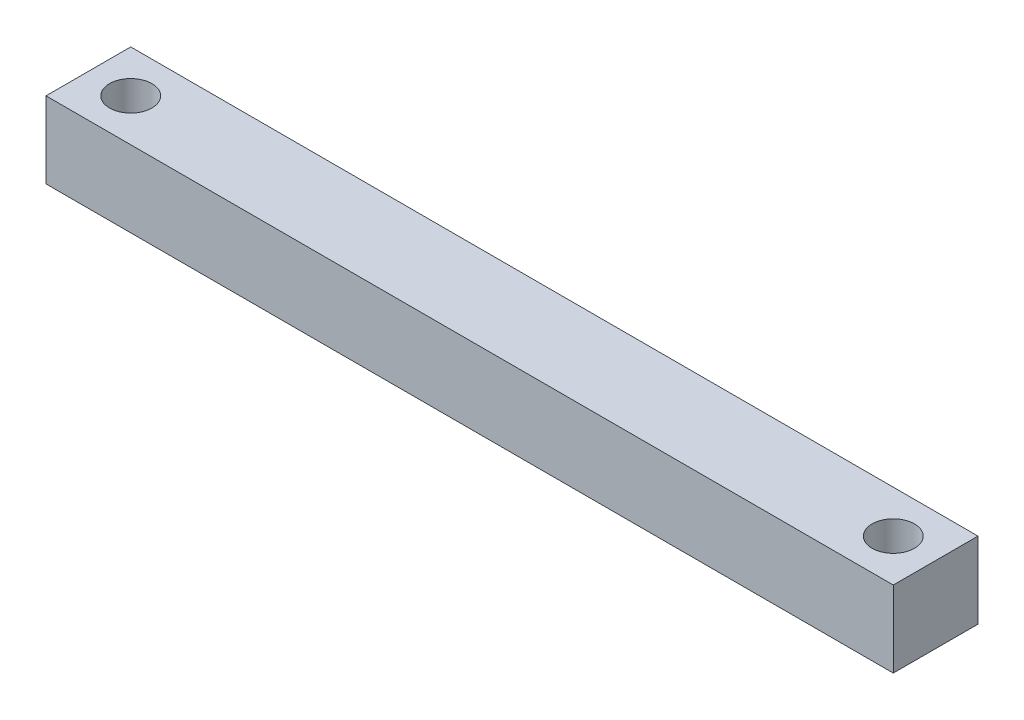
ISO-10303-21;
HEADER;
FILE_DESCRIPTION(('STEP AP214'),'2;1');
FILE_NAME('part.step','',(''),(''),'','','');
FILE_SCHEMA(('AUTOMOTIVE_DESIGN { 1 0 10303 214 1 1 1 1 }'));
ENDSEC;
DATA;
#1=APPLICATION_CONTEXT('core data for automotive mechanical design processes');
#2=APPLICATION_PROTOCOL_DEFINITION('international standard','automotive_design',2000,#1);
#3=PRODUCT_CONTEXT('',#1,'mechanical');
#4=PRODUCT('Part','Part','',(#3));
#5=PRODUCT_RELATED_PRODUCT_CATEGORY('part','',(#4));
#6=PRODUCT_DEFINITION_FORMATION('','',#4);
#7=PRODUCT_DEFINITION_CONTEXT('part definition',#1,'design');
#8=PRODUCT_DEFINITION('design','',#6,#7);
#9=PRODUCT_DEFINITION_SHAPE('','',#8);
#10=(LENGTH_UNIT() NAMED_UNIT(*) SI_UNIT(.MILLI.,.METRE.));
#11=(NAMED_UNIT(*) PLANE_ANGLE_UNIT() SI_UNIT($,.RADIAN.));
#12=(NAMED_UNIT(*) SI_UNIT($,.STERADIAN.) SOLID_ANGLE_UNIT());
#13=UNCERTAINTY_MEASURE_WITH_UNIT(LENGTH_MEASURE(1.E-05),#10,'distance_accuracy_value','');
#14=(GEOMETRIC_REPRESENTATION_CONTEXT(3) GLOBAL_UNCERTAINTY_ASSIGNED_CONTEXT((#13)) GLOBAL_UNIT_ASSIGNED_CONTEXT((#10,
#11,#12)) REPRESENTATION_CONTEXT('',''));
#15=CARTESIAN_POINT('',(0.,0.,0.));
#16=DIRECTION('',(0.,0.,1.));
#17=DIRECTION('',(1.,0.,0.));
#18=AXIS2_PLACEMENT_3D('',#15,#16,#17);
#19=CARTESIAN_POINT('',(-50.,9.00488900129855,-5.));
#20=DIRECTION('',(1.,0.,0.));
#21=DIRECTION('',(0.,0.,-1.));
#22=AXIS2_PLACEMENT_3D('',#19,#20,#21);
#23=PLANE('',#22);
#24=DIRECTION('',(0.,0.,1.));
#25=VECTOR('',#24,1.);
#26=CARTESIAN_POINT('',(-50.,0.,-5.));
#27=LINE('',#26,#25);
#28=CARTESIAN_POINT('',(-50.,0.,-5.));
#29=VERTEX_POINT('',#28);
#30=CARTESIAN_POINT('',(-50.,0.,5.));
#31=VERTEX_POINT('',#30);
#32=EDGE_CURVE('E99',#29,#31,#27,.T.);
#33=ORIENTED_EDGE('',*,*,#32,.T.);
#34=DIRECTION('',(0.,-1.,0.));
#35=VECTOR('',#34,1.);
#36=CARTESIAN_POINT('',(-50.,9.00488900129855,5.));
#37=LINE('',#36,#35);
#38=CARTESIAN_POINT('',(-50.,9.00488900129855,5.));
#39=VERTEX_POINT('',#38);
#40=EDGE_CURVE('E11',#39,#31,#37,.T.);
#41=ORIENTED_EDGE('',*,*,#40,.F.);
#42=DIRECTION('',(0.,0.,1.));
#43=VECTOR('',#42,1.);
#44=CARTESIAN_POINT('',(-50.,9.00488900129855,-5.));
#45=LINE('',#44,#43);
#46=CARTESIAN_POINT('',(-50.,9.00488900129855,-5.));
#47=VERTEX_POINT('',#46);
#48=EDGE_CURVE('E87',#47,#39,#45,.T.);
#49=ORIENTED_EDGE('',*,*,#48,.F.);
#50=DIRECTION('',(0.,-1.,0.));
#51=VECTOR('',#50,1.);
#52=CARTESIAN_POINT('',(-50.,9.00488900129855,-5.));
#53=LINE('',#52,#51);
#54=EDGE_CURVE('E95',#47,#29,#53,.T.);
#55=ORIENTED_EDGE('',*,*,#54,.T.);
#56=EDGE_LOOP('',(#33,#41,#49,#55));
#57=FACE_BOUND('',#56,.T.);
#58=ADVANCED_FACE('F36',(#57),#23,.F.);
#59=CARTESIAN_POINT('',(-50.,9.00488900129855,5.));
#60=DIRECTION('',(0.,0.,-1.));
#61=DIRECTION('',(-1.,0.,0.));
#62=AXIS2_PLACEMENT_3D('',#59,#60,#61);
#63=PLANE('',#62);
#64=DIRECTION('',(1.,0.,0.));
#65=VECTOR('',#64,1.);
#66=CARTESIAN_POINT('',(-50.,0.,5.));
#67=LINE('',#66,#65);
#68=CARTESIAN_POINT('',(50.,0.,5.));
#69=VERTEX_POINT('',#68);
#70=EDGE_CURVE('E91',#31,#69,#67,.T.);
#71=ORIENTED_EDGE('',*,*,#70,.T.);
#72=DIRECTION('',(0.,-1.,0.));
#73=VECTOR('',#72,1.);
#74=CARTESIAN_POINT('',(50.,9.00488900129855,5.));
#75=LINE('',#74,#73);
#76=CARTESIAN_POINT('',(50.,9.00488900129855,5.));
#77=VERTEX_POINT('',#76);
#78=EDGE_CURVE('E44',#77,#69,#75,.T.);
#79=ORIENTED_EDGE('',*,*,#78,.F.);
#80=DIRECTION('',(1.,0.,0.));
#81=VECTOR('',#80,1.);
#82=CARTESIAN_POINT('',(-50.,9.00488900129855,5.));
#83=LINE('',#82,#81);
#84=EDGE_CURVE('E82',#39,#77,#83,.T.);
#85=ORIENTED_EDGE('',*,*,#84,.F.);
#86=ORIENTED_EDGE('',*,*,#40,.T.);
#87=EDGE_LOOP('',(#71,#79,#85,#86));
#88=FACE_BOUND('',#87,.T.);
#89=ADVANCED_FACE('F90',(#88),#63,.F.);
#90=CARTESIAN_POINT('',(50.,9.00488900129855,-5.));
#91=DIRECTION('',(-1.,0.,0.));
#92=DIRECTION('',(0.,0.,1.));
#93=AXIS2_PLACEMENT_3D('',#90,#91,#92);
#94=PLANE('',#93);
#95=DIRECTION('',(0.,0.,-1.));
#96=VECTOR('',#95,1.);
#97=CARTESIAN_POINT('',(50.,0.,-5.));
#98=LINE('',#97,#96);
#99=CARTESIAN_POINT('',(50.,0.,-5.));
#100=VERTEX_POINT('',#99);
#101=EDGE_CURVE('E69',#69,#100,#98,.T.);
#102=ORIENTED_EDGE('',*,*,#101,.T.);
#103=DIRECTION('',(0.,-1.,0.));
#104=VECTOR('',#103,1.);
#105=CARTESIAN_POINT('',(50.,9.00488900129855,-5.));
#106=LINE('',#105,#104);
#107=CARTESIAN_POINT('',(50.,9.00488900129855,-5.));
#108=VERTEX_POINT('',#107);
#109=EDGE_CURVE('E92',#108,#100,#106,.T.);
#110=ORIENTED_EDGE('',*,*,#109,.F.);
#111=DIRECTION('',(0.,0.,-1.));
#112=VECTOR('',#111,1.);
#113=CARTESIAN_POINT('',(50.,9.00488900129855,-5.));
#114=LINE('',#113,#112);
#115=EDGE_CURVE('E85',#77,#108,#114,.T.);
#116=ORIENTED_EDGE('',*,*,#115,.F.);
#117=ORIENTED_EDGE('',*,*,#78,.T.);
#118=EDGE_LOOP('',(#102,#110,#116,#117));
#119=FACE_BOUND('',#118,.T.);
#120=ADVANCED_FACE('F93',(#119),#94,.F.);
#121=CARTESIAN_POINT('',(-50.,9.00488900129855,-5.));
#122=DIRECTION('',(0.,0.,1.));
#123=DIRECTION('',(1.,0.,0.));
#124=AXIS2_PLACEMENT_3D('',#121,#122,#123);
#125=PLANE('',#124);
#126=DIRECTION('',(-1.,0.,0.));
#127=VECTOR('',#126,1.);
#128=CARTESIAN_POINT('',(-50.,0.,-5.));
#129=LINE('',#128,#127);
#130=EDGE_CURVE('E75',#100,#29,#129,.T.);
#131=ORIENTED_EDGE('',*,*,#130,.T.);
#132=ORIENTED_EDGE('',*,*,#54,.F.);
#133=DIRECTION('',(-1.,0.,0.));
#134=VECTOR('',#133,1.);
#135=CARTESIAN_POINT('',(-50.,9.00488900129855,-5.));
#136=LINE('',#135,#134);
#137=EDGE_CURVE('E52',#108,#47,#136,.T.);
#138=ORIENTED_EDGE('',*,*,#137,.F.);
#139=ORIENTED_EDGE('',*,*,#109,.T.);
#140=EDGE_LOOP('',(#131,#132,#138,#139));
#141=FACE_BOUND('',#140,.T.);
#142=ADVANCED_FACE('F107',(#141),#125,.F.);
#143=CARTESIAN_POINT('',(0.,9.00488900129855,0.));
#144=DIRECTION('',(0.,1.,0.));
#145=DIRECTION('',(0.,0.,1.));
#146=AXIS2_PLACEMENT_3D('',#143,#144,#145);
#147=PLANE('',#146);
#148=CARTESIAN_POINT('',(-45.,9.00488900129855,0.));
#149=DIRECTION('',(0.,1.,0.));
#150=DIRECTION('',(0.,0.,1.));
#151=AXIS2_PLACEMENT_3D('',#148,#149,#150);
#152=CIRCLE('',#151,2.5);
#153=CARTESIAN_POINT('',(-45.,9.00488900129855,2.5));
#154=VERTEX_POINT('',#153);
#155=EDGE_CURVE('E119',#154,#154,#152,.T.);
#156=ORIENTED_EDGE('',*,*,#155,.F.);
#157=EDGE_LOOP('',(#156));
#158=FACE_BOUND('',#157,.T.);
#159=CARTESIAN_POINT('',(45.,9.00488900129855,0.));
#160=DIRECTION('',(0.,1.,0.));
#161=DIRECTION('',(0.,0.,1.));
#162=AXIS2_PLACEMENT_3D('',#159,#160,#161);
#163=CIRCLE('',#162,2.5);
#164=CARTESIAN_POINT('',(45.,9.00488900129855,2.5));
#165=VERTEX_POINT('',#164);
#166=EDGE_CURVE('E113',#165,#165,#163,.T.);
#167=ORIENTED_EDGE('',*,*,#166,.F.);
#168=EDGE_LOOP('',(#167));
#169=FACE_BOUND('',#168,.T.);
#170=ORIENTED_EDGE('',*,*,#48,.T.);
#171=ORIENTED_EDGE('',*,*,#84,.T.);
#172=ORIENTED_EDGE('',*,*,#115,.T.);
#173=ORIENTED_EDGE('',*,*,#137,.T.);
#174=EDGE_LOOP('',(#170,#171,#172,#173));
#175=FACE_BOUND('',#174,.T.);
#176=ADVANCED_FACE('F83',(#158,#169,#175),#147,.T.);
#177=CARTESIAN_POINT('',(0.,0.,0.));
#178=DIRECTION('',(0.,1.,0.));
#179=DIRECTION('',(0.,0.,1.));
#180=AXIS2_PLACEMENT_3D('',#177,#178,#179);
#181=PLANE('',#180);
#182=CARTESIAN_POINT('',(-45.,0.,0.));
#183=DIRECTION('',(0.,1.,0.));
#184=DIRECTION('',(0.,0.,1.));
#185=AXIS2_PLACEMENT_3D('',#182,#183,#184);
#186=CIRCLE('',#185,2.5);
#187=CARTESIAN_POINT('',(-45.,0.,2.5));
#188=VERTEX_POINT('',#187);
#189=EDGE_CURVE('E102',#188,#188,#186,.T.);
#190=ORIENTED_EDGE('',*,*,#189,.T.);
#191=EDGE_LOOP('',(#190));
#192=FACE_BOUND('',#191,.T.);
#193=CARTESIAN_POINT('',(45.,0.,0.));
#194=DIRECTION('',(0.,1.,0.));
#195=DIRECTION('',(0.,0.,1.));
#196=AXIS2_PLACEMENT_3D('',#193,#194,#195);
#197=CIRCLE('',#196,2.5);
#198=CARTESIAN_POINT('',(45.,0.,2.5));
#199=VERTEX_POINT('',#198);
#200=EDGE_CURVE('E116',#199,#199,#197,.T.);
#201=ORIENTED_EDGE('',*,*,#200,.T.);
#202=EDGE_LOOP('',(#201));
#203=FACE_BOUND('',#202,.T.);
#204=ORIENTED_EDGE('',*,*,#32,.F.);
#205=ORIENTED_EDGE('',*,*,#130,.F.);
#206=ORIENTED_EDGE('',*,*,#101,.F.);
#207=ORIENTED_EDGE('',*,*,#70,.F.);
#208=EDGE_LOOP('',(#204,#205,#206,#207));
#209=FACE_BOUND('',#208,.T.);
#210=ADVANCED_FACE('F110',(#192,#203,#209),#181,.F.);
#211=CARTESIAN_POINT('',(45.,0.,0.));
#212=DIRECTION('',(0.,1.,0.));
#213=DIRECTION('',(0.,0.,1.));
#214=AXIS2_PLACEMENT_3D('',#211,#212,#213);
#215=CYLINDRICAL_SURFACE('',#214,2.5);
#216=ORIENTED_EDGE('',*,*,#200,.F.);
#217=EDGE_LOOP('',(#216));
#218=FACE_BOUND('',#217,.T.);
#219=ORIENTED_EDGE('',*,*,#166,.T.);
#220=EDGE_LOOP('',(#219));
#221=FACE_BOUND('',#220,.T.);
#222=ADVANCED_FACE('F130',(#218,#221),#215,.F.);
#223=CARTESIAN_POINT('',(-45.,0.,0.));
#224=DIRECTION('',(0.,1.,0.));
#225=DIRECTION('',(0.,0.,1.));
#226=AXIS2_PLACEMENT_3D('',#223,#224,#225);
#227=CYLINDRICAL_SURFACE('',#226,2.5);
#228=ORIENTED_EDGE('',*,*,#189,.F.);
#229=EDGE_LOOP('',(#228));
#230=FACE_BOUND('',#229,.T.);
#231=ORIENTED_EDGE('',*,*,#155,.T.);
#232=EDGE_LOOP('',(#231));
#233=FACE_BOUND('',#232,.T.);
#234=ADVANCED_FACE('F127',(#230,#233),#227,.F.);
#235=CLOSED_SHELL('',(#58,#89,#120,#142,#176,#210,#222,#234));
#236=MANIFOLD_SOLID_BREP('B2',#235);
#237=ADVANCED_BREP_SHAPE_REPRESENTATION('',(#18,#236),#14);
#238=SHAPE_DEFINITION_REPRESENTATION(#9,#237);
ENDSEC;
END-ISO-10303-21;
